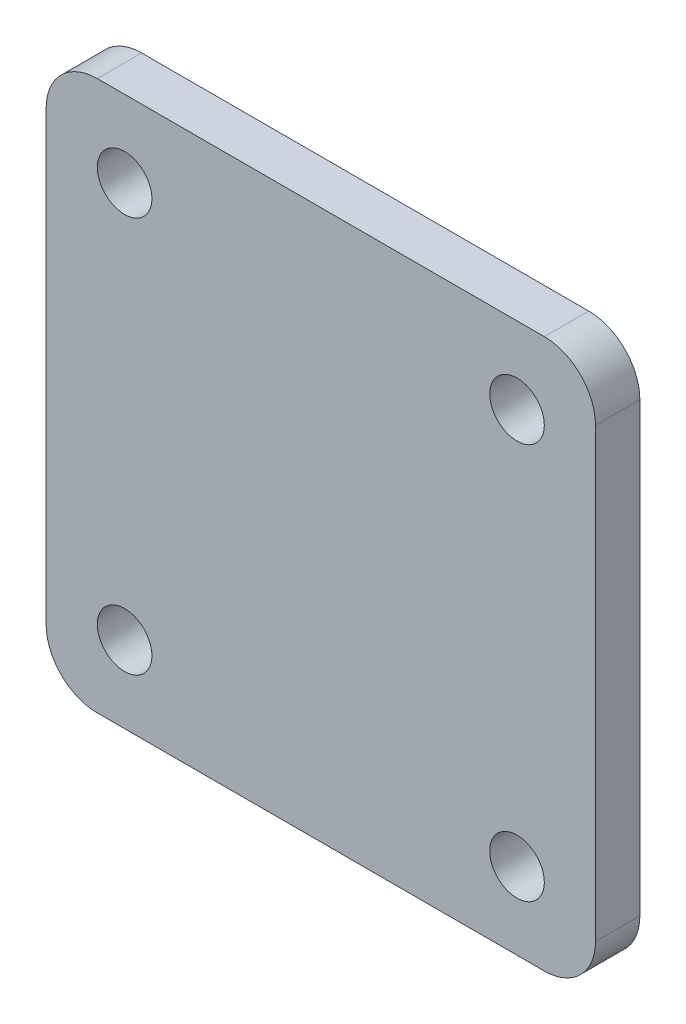
ISO-10303-21;
HEADER;
FILE_DESCRIPTION(('STEP AP214'),'2;1');
FILE_NAME('part.step','',(''),(''),'','','');
FILE_SCHEMA(('AUTOMOTIVE_DESIGN { 1 0 10303 214 1 1 1 1 }'));
ENDSEC;
DATA;
#1=APPLICATION_CONTEXT('core data for automotive mechanical design processes');
#2=APPLICATION_PROTOCOL_DEFINITION('international standard','automotive_design',2000,#1);
#3=PRODUCT_CONTEXT('',#1,'mechanical');
#4=PRODUCT('Part','Part','',(#3));
#5=PRODUCT_RELATED_PRODUCT_CATEGORY('part','',(#4));
#6=PRODUCT_DEFINITION_FORMATION('','',#4);
#7=PRODUCT_DEFINITION_CONTEXT('part definition',#1,'design');
#8=PRODUCT_DEFINITION('design','',#6,#7);
#9=PRODUCT_DEFINITION_SHAPE('','',#8);
#10=(LENGTH_UNIT() NAMED_UNIT(*) SI_UNIT(.MILLI.,.METRE.));
#11=(NAMED_UNIT(*) PLANE_ANGLE_UNIT() SI_UNIT($,.RADIAN.));
#12=(NAMED_UNIT(*) SI_UNIT($,.STERADIAN.) SOLID_ANGLE_UNIT());
#13=UNCERTAINTY_MEASURE_WITH_UNIT(LENGTH_MEASURE(1.E-05),#10,'distance_accuracy_value','');
#14=(GEOMETRIC_REPRESENTATION_CONTEXT(3) GLOBAL_UNCERTAINTY_ASSIGNED_CONTEXT((#13)) GLOBAL_UNIT_ASSIGNED_CONTEXT((#10,
#11,#12)) REPRESENTATION_CONTEXT('',''));
#15=CARTESIAN_POINT('',(0.,0.,0.));
#16=DIRECTION('',(0.,0.,1.));
#17=DIRECTION('',(1.,0.,0.));
#18=AXIS2_PLACEMENT_3D('',#15,#16,#17);
#19=CARTESIAN_POINT('',(0.,0.,2.6));
#20=DIRECTION('',(0.,0.,-1.));
#21=DIRECTION('',(-1.,0.,0.));
#22=AXIS2_PLACEMENT_3D('',#19,#20,#21);
#23=PLANE('',#22);
#24=DIRECTION('',(0.,-1.,0.));
#25=VECTOR('',#24,1.);
#26=CARTESIAN_POINT('',(-16.1,-16.1,2.6));
#27=LINE('',#26,#25);
#28=CARTESIAN_POINT('',(-16.1,13.1,2.6));
#29=VERTEX_POINT('',#28);
#30=CARTESIAN_POINT('',(-16.1,-13.1,2.6));
#31=VERTEX_POINT('',#30);
#32=EDGE_CURVE('E175',#29,#31,#27,.T.);
#33=ORIENTED_EDGE('',*,*,#32,.T.);
#34=CARTESIAN_POINT('',(-13.1,-13.1,2.6));
#35=DIRECTION('',(0.,0.,-1.));
#36=DIRECTION('',(-1.,0.,0.));
#37=AXIS2_PLACEMENT_3D('',#34,#35,#36);
#38=CIRCLE('',#37,3.);
#39=CARTESIAN_POINT('',(-13.1,-16.1,2.6));
#40=VERTEX_POINT('',#39);
#41=EDGE_CURVE('E152',#31,#40,#38,.F.);
#42=ORIENTED_EDGE('',*,*,#41,.T.);
#43=DIRECTION('',(1.,0.,0.));
#44=VECTOR('',#43,1.);
#45=CARTESIAN_POINT('',(-16.1,-16.1,2.6));
#46=LINE('',#45,#44);
#47=CARTESIAN_POINT('',(13.1,-16.1,2.6));
#48=VERTEX_POINT('',#47);
#49=EDGE_CURVE('E123',#40,#48,#46,.T.);
#50=ORIENTED_EDGE('',*,*,#49,.T.);
#51=CARTESIAN_POINT('',(13.1,-13.1,2.6));
#52=DIRECTION('',(0.,0.,-1.));
#53=DIRECTION('',(-1.,0.,0.));
#54=AXIS2_PLACEMENT_3D('',#51,#52,#53);
#55=CIRCLE('',#54,3.);
#56=CARTESIAN_POINT('',(16.1,-13.1,2.6));
#57=VERTEX_POINT('',#56);
#58=EDGE_CURVE('E150',#48,#57,#55,.F.);
#59=ORIENTED_EDGE('',*,*,#58,.T.);
#60=DIRECTION('',(0.,1.,0.));
#61=VECTOR('',#60,1.);
#62=CARTESIAN_POINT('',(16.1,-16.1,2.6));
#63=LINE('',#62,#61);
#64=CARTESIAN_POINT('',(16.1,13.1,2.6));
#65=VERTEX_POINT('',#64);
#66=EDGE_CURVE('E130',#57,#65,#63,.T.);
#67=ORIENTED_EDGE('',*,*,#66,.T.);
#68=CARTESIAN_POINT('',(13.1,13.1,2.6));
#69=DIRECTION('',(0.,0.,-1.));
#70=DIRECTION('',(-1.,0.,0.));
#71=AXIS2_PLACEMENT_3D('',#68,#69,#70);
#72=CIRCLE('',#71,3.);
#73=CARTESIAN_POINT('',(13.1,16.1,2.6));
#74=VERTEX_POINT('',#73);
#75=EDGE_CURVE('E58',#65,#74,#72,.F.);
#76=ORIENTED_EDGE('',*,*,#75,.T.);
#77=DIRECTION('',(-1.,0.,0.));
#78=VECTOR('',#77,1.);
#79=CARTESIAN_POINT('',(-16.1,16.1,2.6));
#80=LINE('',#79,#78);
#81=CARTESIAN_POINT('',(-13.1,16.1,2.6));
#82=VERTEX_POINT('',#81);
#83=EDGE_CURVE('E133',#74,#82,#80,.T.);
#84=ORIENTED_EDGE('',*,*,#83,.T.);
#85=CARTESIAN_POINT('',(-13.1,13.1,2.6));
#86=DIRECTION('',(0.,0.,-1.));
#87=DIRECTION('',(-1.,0.,0.));
#88=AXIS2_PLACEMENT_3D('',#85,#86,#87);
#89=CIRCLE('',#88,3.);
#90=EDGE_CURVE('E147',#82,#29,#89,.F.);
#91=ORIENTED_EDGE('',*,*,#90,.T.);
#92=EDGE_LOOP('',(#33,#42,#50,#59,#67,#76,#84,#91));
#93=FACE_BOUND('',#92,.T.);
#94=CARTESIAN_POINT('',(-11.5,-11.6,2.6));
#95=DIRECTION('',(0.,0.,1.));
#96=DIRECTION('',(1.,0.,0.));
#97=AXIS2_PLACEMENT_3D('',#94,#95,#96);
#98=CIRCLE('',#97,1.6);
#99=CARTESIAN_POINT('',(-9.90000000000001,-11.6,2.6));
#100=VERTEX_POINT('',#99);
#101=EDGE_CURVE('E168',#100,#100,#98,.T.);
#102=ORIENTED_EDGE('',*,*,#101,.F.);
#103=EDGE_LOOP('',(#102));
#104=FACE_BOUND('',#103,.T.);
#105=CARTESIAN_POINT('',(11.5,11.6,2.6));
#106=DIRECTION('',(0.,0.,1.));
#107=DIRECTION('',(1.,0.,0.));
#108=AXIS2_PLACEMENT_3D('',#105,#106,#107);
#109=CIRCLE('',#108,1.6);
#110=CARTESIAN_POINT('',(13.1,11.6,2.6));
#111=VERTEX_POINT('',#110);
#112=EDGE_CURVE('E180',#111,#111,#109,.T.);
#113=ORIENTED_EDGE('',*,*,#112,.F.);
#114=EDGE_LOOP('',(#113));
#115=FACE_BOUND('',#114,.T.);
#116=CARTESIAN_POINT('',(-11.5,11.6,2.6));
#117=DIRECTION('',(0.,0.,1.));
#118=DIRECTION('',(1.,0.,0.));
#119=AXIS2_PLACEMENT_3D('',#116,#117,#118);
#120=CIRCLE('',#119,1.6);
#121=CARTESIAN_POINT('',(-9.9,11.6,2.6));
#122=VERTEX_POINT('',#121);
#123=EDGE_CURVE('E185',#122,#122,#120,.T.);
#124=ORIENTED_EDGE('',*,*,#123,.F.);
#125=EDGE_LOOP('',(#124));
#126=FACE_BOUND('',#125,.T.);
#127=CARTESIAN_POINT('',(11.5,-11.6,2.6));
#128=DIRECTION('',(0.,0.,1.));
#129=DIRECTION('',(1.,0.,0.));
#130=AXIS2_PLACEMENT_3D('',#127,#128,#129);
#131=CIRCLE('',#130,1.6);
#132=CARTESIAN_POINT('',(13.1,-11.6,2.6));
#133=VERTEX_POINT('',#132);
#134=EDGE_CURVE('E191',#133,#133,#131,.T.);
#135=ORIENTED_EDGE('',*,*,#134,.F.);
#136=EDGE_LOOP('',(#135));
#137=FACE_BOUND('',#136,.T.);
#138=ADVANCED_FACE('F37',(#93,#104,#115,#126,#137),#23,.F.);
#139=CARTESIAN_POINT('',(0.,0.,0.));
#140=DIRECTION('',(0.,0.,-1.));
#141=DIRECTION('',(-1.,0.,0.));
#142=AXIS2_PLACEMENT_3D('',#139,#140,#141);
#143=PLANE('',#142);
#144=CARTESIAN_POINT('',(-11.5,11.6,0.));
#145=DIRECTION('',(0.,0.,1.));
#146=DIRECTION('',(1.,0.,0.));
#147=AXIS2_PLACEMENT_3D('',#144,#145,#146);
#148=CIRCLE('',#147,1.6);
#149=CARTESIAN_POINT('',(-9.9,11.6,0.));
#150=VERTEX_POINT('',#149);
#151=EDGE_CURVE('E188',#150,#150,#148,.T.);
#152=ORIENTED_EDGE('',*,*,#151,.T.);
#153=EDGE_LOOP('',(#152));
#154=FACE_BOUND('',#153,.T.);
#155=CARTESIAN_POINT('',(-11.5,-11.6,0.));
#156=DIRECTION('',(0.,0.,1.));
#157=DIRECTION('',(1.,0.,0.));
#158=AXIS2_PLACEMENT_3D('',#155,#156,#157);
#159=CIRCLE('',#158,1.6);
#160=CARTESIAN_POINT('',(-9.90000000000001,-11.6,0.));
#161=VERTEX_POINT('',#160);
#162=EDGE_CURVE('E171',#161,#161,#159,.T.);
#163=ORIENTED_EDGE('',*,*,#162,.T.);
#164=EDGE_LOOP('',(#163));
#165=FACE_BOUND('',#164,.T.);
#166=DIRECTION('',(1.,0.,0.));
#167=VECTOR('',#166,1.);
#168=CARTESIAN_POINT('',(-16.1,-16.1,0.));
#169=LINE('',#168,#167);
#170=CARTESIAN_POINT('',(-13.1,-16.1,0.));
#171=VERTEX_POINT('',#170);
#172=CARTESIAN_POINT('',(13.1,-16.1,0.));
#173=VERTEX_POINT('',#172);
#174=EDGE_CURVE('E120',#171,#173,#169,.T.);
#175=ORIENTED_EDGE('',*,*,#174,.F.);
#176=CARTESIAN_POINT('',(-13.1,-13.1,0.));
#177=DIRECTION('',(0.,0.,-1.));
#178=DIRECTION('',(-1.,0.,0.));
#179=AXIS2_PLACEMENT_3D('',#176,#177,#178);
#180=CIRCLE('',#179,3.);
#181=CARTESIAN_POINT('',(-16.1,-13.1,0.));
#182=VERTEX_POINT('',#181);
#183=EDGE_CURVE('E103',#171,#182,#180,.T.);
#184=ORIENTED_EDGE('',*,*,#183,.T.);
#185=DIRECTION('',(0.,-1.,0.));
#186=VECTOR('',#185,1.);
#187=CARTESIAN_POINT('',(-16.1,-16.1,0.));
#188=LINE('',#187,#186);
#189=CARTESIAN_POINT('',(-16.1,13.1,0.));
#190=VERTEX_POINT('',#189);
#191=EDGE_CURVE('E131',#190,#182,#188,.T.);
#192=ORIENTED_EDGE('',*,*,#191,.F.);
#193=CARTESIAN_POINT('',(-13.1,13.1,0.));
#194=DIRECTION('',(0.,0.,-1.));
#195=DIRECTION('',(-1.,0.,0.));
#196=AXIS2_PLACEMENT_3D('',#193,#194,#195);
#197=CIRCLE('',#196,3.);
#198=CARTESIAN_POINT('',(-13.1,16.1,0.));
#199=VERTEX_POINT('',#198);
#200=EDGE_CURVE('E124',#190,#199,#197,.T.);
#201=ORIENTED_EDGE('',*,*,#200,.T.);
#202=DIRECTION('',(-1.,0.,0.));
#203=VECTOR('',#202,1.);
#204=CARTESIAN_POINT('',(-16.1,16.1,0.));
#205=LINE('',#204,#203);
#206=CARTESIAN_POINT('',(13.1,16.1,0.));
#207=VERTEX_POINT('',#206);
#208=EDGE_CURVE('E135',#207,#199,#205,.T.);
#209=ORIENTED_EDGE('',*,*,#208,.F.);
#210=CARTESIAN_POINT('',(13.1,13.1,0.));
#211=DIRECTION('',(0.,0.,-1.));
#212=DIRECTION('',(-1.,0.,0.));
#213=AXIS2_PLACEMENT_3D('',#210,#211,#212);
#214=CIRCLE('',#213,3.);
#215=CARTESIAN_POINT('',(16.1,13.1,0.));
#216=VERTEX_POINT('',#215);
#217=EDGE_CURVE('E141',#207,#216,#214,.T.);
#218=ORIENTED_EDGE('',*,*,#217,.T.);
#219=DIRECTION('',(0.,1.,0.));
#220=VECTOR('',#219,1.);
#221=CARTESIAN_POINT('',(16.1,-16.1,0.));
#222=LINE('',#221,#220);
#223=CARTESIAN_POINT('',(16.1,-13.1,0.));
#224=VERTEX_POINT('',#223);
#225=EDGE_CURVE('E163',#224,#216,#222,.T.);
#226=ORIENTED_EDGE('',*,*,#225,.F.);
#227=CARTESIAN_POINT('',(13.1,-13.1,0.));
#228=DIRECTION('',(0.,0.,-1.));
#229=DIRECTION('',(-1.,0.,0.));
#230=AXIS2_PLACEMENT_3D('',#227,#228,#229);
#231=CIRCLE('',#230,3.);
#232=EDGE_CURVE('E114',#224,#173,#231,.T.);
#233=ORIENTED_EDGE('',*,*,#232,.T.);
#234=EDGE_LOOP('',(#175,#184,#192,#201,#209,#218,#226,#233));
#235=FACE_BOUND('',#234,.T.);
#236=CARTESIAN_POINT('',(11.5,11.6,0.));
#237=DIRECTION('',(0.,0.,1.));
#238=DIRECTION('',(1.,0.,0.));
#239=AXIS2_PLACEMENT_3D('',#236,#237,#238);
#240=CIRCLE('',#239,1.6);
#241=CARTESIAN_POINT('',(13.1,11.6,0.));
#242=VERTEX_POINT('',#241);
#243=EDGE_CURVE('E182',#242,#242,#240,.T.);
#244=ORIENTED_EDGE('',*,*,#243,.T.);
#245=EDGE_LOOP('',(#244));
#246=FACE_BOUND('',#245,.T.);
#247=CARTESIAN_POINT('',(11.5,-11.6,0.));
#248=DIRECTION('',(0.,0.,1.));
#249=DIRECTION('',(1.,0.,0.));
#250=AXIS2_PLACEMENT_3D('',#247,#248,#249);
#251=CIRCLE('',#250,1.6);
#252=CARTESIAN_POINT('',(13.1,-11.6,0.));
#253=VERTEX_POINT('',#252);
#254=EDGE_CURVE('E194',#253,#253,#251,.T.);
#255=ORIENTED_EDGE('',*,*,#254,.T.);
#256=EDGE_LOOP('',(#255));
#257=FACE_BOUND('',#256,.T.);
#258=ADVANCED_FACE('F127',(#154,#165,#235,#246,#257),#143,.T.);
#259=CARTESIAN_POINT('',(16.1,-16.1,2.6));
#260=DIRECTION('',(-1.,0.,0.));
#261=DIRECTION('',(0.,0.,1.));
#262=AXIS2_PLACEMENT_3D('',#259,#260,#261);
#263=PLANE('',#262);
#264=ORIENTED_EDGE('',*,*,#66,.F.);
#265=DIRECTION('',(0.,0.,-1.));
#266=VECTOR('',#265,1.);
#267=CARTESIAN_POINT('',(16.1,-13.1,2.6));
#268=LINE('',#267,#266);
#269=EDGE_CURVE('E156',#57,#224,#268,.T.);
#270=ORIENTED_EDGE('',*,*,#269,.T.);
#271=ORIENTED_EDGE('',*,*,#225,.T.);
#272=DIRECTION('',(0.,0.,-1.));
#273=VECTOR('',#272,1.);
#274=CARTESIAN_POINT('',(16.1,13.1,2.6));
#275=LINE('',#274,#273);
#276=EDGE_CURVE('E154',#216,#65,#275,.F.);
#277=ORIENTED_EDGE('',*,*,#276,.T.);
#278=EDGE_LOOP('',(#264,#270,#271,#277));
#279=FACE_BOUND('',#278,.T.);
#280=ADVANCED_FACE('F162',(#279),#263,.F.);
#281=CARTESIAN_POINT('',(-16.1,16.1,2.6));
#282=DIRECTION('',(0.,-1.,0.));
#283=DIRECTION('',(0.,0.,-1.));
#284=AXIS2_PLACEMENT_3D('',#281,#282,#283);
#285=PLANE('',#284);
#286=ORIENTED_EDGE('',*,*,#83,.F.);
#287=DIRECTION('',(0.,0.,-1.));
#288=VECTOR('',#287,1.);
#289=CARTESIAN_POINT('',(13.1,16.1,2.6));
#290=LINE('',#289,#288);
#291=EDGE_CURVE('E11',#74,#207,#290,.T.);
#292=ORIENTED_EDGE('',*,*,#291,.T.);
#293=ORIENTED_EDGE('',*,*,#208,.T.);
#294=DIRECTION('',(0.,0.,-1.));
#295=VECTOR('',#294,1.);
#296=CARTESIAN_POINT('',(-13.1,16.1,2.6));
#297=LINE('',#296,#295);
#298=EDGE_CURVE('E45',#199,#82,#297,.F.);
#299=ORIENTED_EDGE('',*,*,#298,.T.);
#300=EDGE_LOOP('',(#286,#292,#293,#299));
#301=FACE_BOUND('',#300,.T.);
#302=ADVANCED_FACE('F220',(#301),#285,.F.);
#303=CARTESIAN_POINT('',(-16.1,-16.1,2.6));
#304=DIRECTION('',(1.,0.,0.));
#305=DIRECTION('',(0.,0.,-1.));
#306=AXIS2_PLACEMENT_3D('',#303,#304,#305);
#307=PLANE('',#306);
#308=ORIENTED_EDGE('',*,*,#191,.T.);
#309=DIRECTION('',(0.,0.,-1.));
#310=VECTOR('',#309,1.);
#311=CARTESIAN_POINT('',(-16.1,-13.1,2.6));
#312=LINE('',#311,#310);
#313=EDGE_CURVE('E108',#182,#31,#312,.F.);
#314=ORIENTED_EDGE('',*,*,#313,.T.);
#315=ORIENTED_EDGE('',*,*,#32,.F.);
#316=DIRECTION('',(0.,0.,-1.));
#317=VECTOR('',#316,1.);
#318=CARTESIAN_POINT('',(-16.1,13.1,2.6));
#319=LINE('',#318,#317);
#320=EDGE_CURVE('E113',#29,#190,#319,.T.);
#321=ORIENTED_EDGE('',*,*,#320,.T.);
#322=EDGE_LOOP('',(#308,#314,#315,#321));
#323=FACE_BOUND('',#322,.T.);
#324=ADVANCED_FACE('F217',(#323),#307,.F.);
#325=CARTESIAN_POINT('',(-16.1,-16.1,2.6));
#326=DIRECTION('',(0.,1.,0.));
#327=DIRECTION('',(0.,0.,1.));
#328=AXIS2_PLACEMENT_3D('',#325,#326,#327);
#329=PLANE('',#328);
#330=ORIENTED_EDGE('',*,*,#49,.F.);
#331=DIRECTION('',(0.,0.,-1.));
#332=VECTOR('',#331,1.);
#333=CARTESIAN_POINT('',(-13.1,-16.1,2.6));
#334=LINE('',#333,#332);
#335=EDGE_CURVE('E107',#40,#171,#334,.T.);
#336=ORIENTED_EDGE('',*,*,#335,.T.);
#337=ORIENTED_EDGE('',*,*,#174,.T.);
#338=DIRECTION('',(0.,0.,-1.));
#339=VECTOR('',#338,1.);
#340=CARTESIAN_POINT('',(13.1,-16.1,2.6));
#341=LINE('',#340,#339);
#342=EDGE_CURVE('E125',#173,#48,#341,.F.);
#343=ORIENTED_EDGE('',*,*,#342,.T.);
#344=EDGE_LOOP('',(#330,#336,#337,#343));
#345=FACE_BOUND('',#344,.T.);
#346=ADVANCED_FACE('F119',(#345),#329,.F.);
#347=CARTESIAN_POINT('',(-11.5,-11.6,2.6));
#348=DIRECTION('',(0.,0.,-1.));
#349=DIRECTION('',(-1.,0.,0.));
#350=AXIS2_PLACEMENT_3D('',#347,#348,#349);
#351=CYLINDRICAL_SURFACE('',#350,1.6);
#352=ORIENTED_EDGE('',*,*,#101,.T.);
#353=EDGE_LOOP('',(#352));
#354=FACE_BOUND('',#353,.T.);
#355=ORIENTED_EDGE('',*,*,#162,.F.);
#356=EDGE_LOOP('',(#355));
#357=FACE_BOUND('',#356,.T.);
#358=ADVANCED_FACE('F212',(#354,#357),#351,.F.);
#359=CARTESIAN_POINT('',(11.5,11.6,2.6));
#360=DIRECTION('',(0.,0.,-1.));
#361=DIRECTION('',(-1.,0.,0.));
#362=AXIS2_PLACEMENT_3D('',#359,#360,#361);
#363=CYLINDRICAL_SURFACE('',#362,1.6);
#364=ORIENTED_EDGE('',*,*,#112,.T.);
#365=EDGE_LOOP('',(#364));
#366=FACE_BOUND('',#365,.T.);
#367=ORIENTED_EDGE('',*,*,#243,.F.);
#368=EDGE_LOOP('',(#367));
#369=FACE_BOUND('',#368,.T.);
#370=ADVANCED_FACE('F324',(#366,#369),#363,.F.);
#371=CARTESIAN_POINT('',(-11.5,11.6,2.6));
#372=DIRECTION('',(0.,0.,-1.));
#373=DIRECTION('',(-1.,0.,0.));
#374=AXIS2_PLACEMENT_3D('',#371,#372,#373);
#375=CYLINDRICAL_SURFACE('',#374,1.6);
#376=ORIENTED_EDGE('',*,*,#123,.T.);
#377=EDGE_LOOP('',(#376));
#378=FACE_BOUND('',#377,.T.);
#379=ORIENTED_EDGE('',*,*,#151,.F.);
#380=EDGE_LOOP('',(#379));
#381=FACE_BOUND('',#380,.T.);
#382=ADVANCED_FACE('F314',(#378,#381),#375,.F.);
#383=CARTESIAN_POINT('',(11.5,-11.6,2.6));
#384=DIRECTION('',(0.,0.,-1.));
#385=DIRECTION('',(-1.,0.,0.));
#386=AXIS2_PLACEMENT_3D('',#383,#384,#385);
#387=CYLINDRICAL_SURFACE('',#386,1.6);
#388=ORIENTED_EDGE('',*,*,#134,.T.);
#389=EDGE_LOOP('',(#388));
#390=FACE_BOUND('',#389,.T.);
#391=ORIENTED_EDGE('',*,*,#254,.F.);
#392=EDGE_LOOP('',(#391));
#393=FACE_BOUND('',#392,.T.);
#394=ADVANCED_FACE('F200',(#390,#393),#387,.F.);
#395=CARTESIAN_POINT('',(-13.1,-13.1,2.6));
#396=DIRECTION('',(0.,0.,-1.));
#397=DIRECTION('',(-1.,0.,0.));
#398=AXIS2_PLACEMENT_3D('',#395,#396,#397);
#399=CYLINDRICAL_SURFACE('',#398,3.);
#400=ORIENTED_EDGE('',*,*,#41,.F.);
#401=ORIENTED_EDGE('',*,*,#313,.F.);
#402=ORIENTED_EDGE('',*,*,#183,.F.);
#403=ORIENTED_EDGE('',*,*,#335,.F.);
#404=EDGE_LOOP('',(#400,#401,#402,#403));
#405=FACE_BOUND('',#404,.T.);
#406=ADVANCED_FACE('F106',(#405),#399,.T.);
#407=CARTESIAN_POINT('',(13.1,-13.1,2.6));
#408=DIRECTION('',(0.,0.,-1.));
#409=DIRECTION('',(-1.,0.,0.));
#410=AXIS2_PLACEMENT_3D('',#407,#408,#409);
#411=CYLINDRICAL_SURFACE('',#410,3.);
#412=ORIENTED_EDGE('',*,*,#58,.F.);
#413=ORIENTED_EDGE('',*,*,#342,.F.);
#414=ORIENTED_EDGE('',*,*,#232,.F.);
#415=ORIENTED_EDGE('',*,*,#269,.F.);
#416=EDGE_LOOP('',(#412,#413,#414,#415));
#417=FACE_BOUND('',#416,.T.);
#418=ADVANCED_FACE('F228',(#417),#411,.T.);
#419=CARTESIAN_POINT('',(13.1,13.1,2.6));
#420=DIRECTION('',(0.,0.,-1.));
#421=DIRECTION('',(-1.,0.,0.));
#422=AXIS2_PLACEMENT_3D('',#419,#420,#421);
#423=CYLINDRICAL_SURFACE('',#422,3.);
#424=ORIENTED_EDGE('',*,*,#75,.F.);
#425=ORIENTED_EDGE('',*,*,#276,.F.);
#426=ORIENTED_EDGE('',*,*,#217,.F.);
#427=ORIENTED_EDGE('',*,*,#291,.F.);
#428=EDGE_LOOP('',(#424,#425,#426,#427));
#429=FACE_BOUND('',#428,.T.);
#430=ADVANCED_FACE('F230',(#429),#423,.T.);
#431=CARTESIAN_POINT('',(-13.1,13.1,2.6));
#432=DIRECTION('',(0.,0.,-1.));
#433=DIRECTION('',(-1.,0.,0.));
#434=AXIS2_PLACEMENT_3D('',#431,#432,#433);
#435=CYLINDRICAL_SURFACE('',#434,3.);
#436=ORIENTED_EDGE('',*,*,#90,.F.);
#437=ORIENTED_EDGE('',*,*,#298,.F.);
#438=ORIENTED_EDGE('',*,*,#200,.F.);
#439=ORIENTED_EDGE('',*,*,#320,.F.);
#440=EDGE_LOOP('',(#436,#437,#438,#439));
#441=FACE_BOUND('',#440,.T.);
#442=ADVANCED_FACE('F39',(#441),#435,.T.);
#443=CLOSED_SHELL('',(#138,#258,#280,#302,#324,#346,#358,#370,#382,#394,#406,#418,#430,#442));
#444=MANIFOLD_SOLID_BREP('B2',#443);
#445=ADVANCED_BREP_SHAPE_REPRESENTATION('',(#18,#444),#14);
#446=SHAPE_DEFINITION_REPRESENTATION(#9,#445);
ENDSEC;
END-ISO-10303-21;
